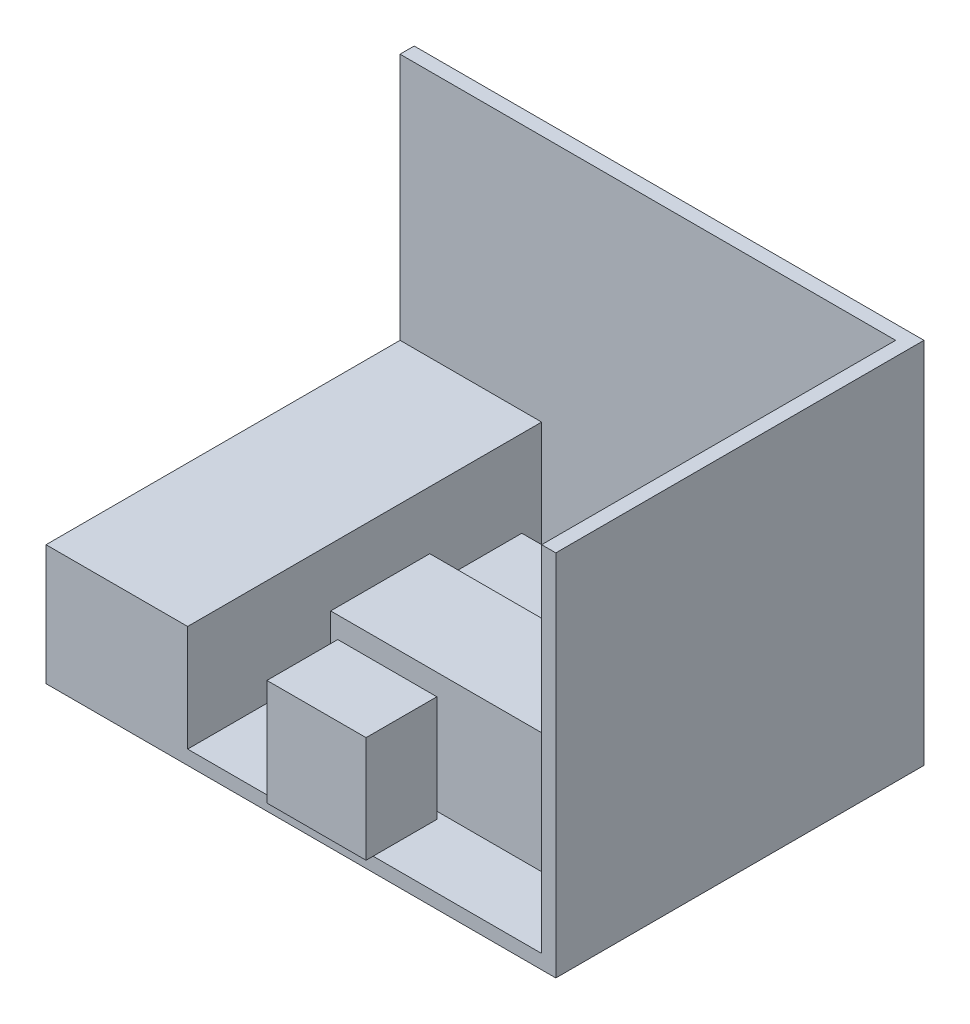
ISO-10303-21;
HEADER;
FILE_DESCRIPTION(('STEP AP214'),'2;1');
FILE_NAME('part.step','',(''),(''),'','','');
FILE_SCHEMA(('AUTOMOTIVE_DESIGN { 1 0 10303 214 1 1 1 1 }'));
ENDSEC;
DATA;
#1=APPLICATION_CONTEXT('core data for automotive mechanical design processes');
#2=APPLICATION_PROTOCOL_DEFINITION('international standard','automotive_design',2000,#1);
#3=PRODUCT_CONTEXT('',#1,'mechanical');
#4=PRODUCT('Part','Part','',(#3));
#5=PRODUCT_RELATED_PRODUCT_CATEGORY('part','',(#4));
#6=PRODUCT_DEFINITION_FORMATION('','',#4);
#7=PRODUCT_DEFINITION_CONTEXT('part definition',#1,'design');
#8=PRODUCT_DEFINITION('design','',#6,#7);
#9=PRODUCT_DEFINITION_SHAPE('','',#8);
#10=(LENGTH_UNIT() NAMED_UNIT(*) SI_UNIT(.MILLI.,.METRE.));
#11=(NAMED_UNIT(*) PLANE_ANGLE_UNIT() SI_UNIT($,.RADIAN.));
#12=(NAMED_UNIT(*) SI_UNIT($,.STERADIAN.) SOLID_ANGLE_UNIT());
#13=UNCERTAINTY_MEASURE_WITH_UNIT(LENGTH_MEASURE(1.E-05),#10,'distance_accuracy_value','');
#14=(GEOMETRIC_REPRESENTATION_CONTEXT(3) GLOBAL_UNCERTAINTY_ASSIGNED_CONTEXT((#13)) GLOBAL_UNIT_ASSIGNED_CONTEXT((#10,
#11,#12)) REPRESENTATION_CONTEXT('',''));
#15=CARTESIAN_POINT('',(0.,0.,0.));
#16=DIRECTION('',(0.,0.,1.));
#17=DIRECTION('',(1.,0.,0.));
#18=AXIS2_PLACEMENT_3D('',#15,#16,#17);
#19=CARTESIAN_POINT('',(0.,100.,0.));
#20=DIRECTION('',(0.,1.,0.));
#21=DIRECTION('',(0.,0.,1.));
#22=AXIS2_PLACEMENT_3D('',#19,#20,#21);
#23=PLANE('',#22);
#24=DIRECTION('',(1.,0.,0.));
#25=VECTOR('',#24,1.);
#26=CARTESIAN_POINT('',(1610.,100.,-1250.));
#27=LINE('',#26,#25);
#28=CARTESIAN_POINT('',(1610.,100.,-1250.));
#29=VERTEX_POINT('',#28);
#30=CARTESIAN_POINT('',(2310.,100.,-1250.));
#31=VERTEX_POINT('',#30);
#32=EDGE_CURVE('E224',#29,#31,#27,.T.);
#33=ORIENTED_EDGE('',*,*,#32,.F.);
#34=DIRECTION('',(0.,0.,1.));
#35=VECTOR('',#34,1.);
#36=CARTESIAN_POINT('',(1610.,100.,-1250.));
#37=LINE('',#36,#35);
#38=CARTESIAN_POINT('',(1610.,100.,-1750.));
#39=VERTEX_POINT('',#38);
#40=EDGE_CURVE('E219',#39,#29,#37,.T.);
#41=ORIENTED_EDGE('',*,*,#40,.F.);
#42=DIRECTION('',(-1.,0.,0.));
#43=VECTOR('',#42,1.);
#44=CARTESIAN_POINT('',(1610.,100.,-1750.));
#45=LINE('',#44,#43);
#46=CARTESIAN_POINT('',(2310.,100.,-1750.));
#47=VERTEX_POINT('',#46);
#48=EDGE_CURVE('E235',#47,#39,#45,.T.);
#49=ORIENTED_EDGE('',*,*,#48,.F.);
#50=DIRECTION('',(0.,0.,-1.));
#51=VECTOR('',#50,1.);
#52=CARTESIAN_POINT('',(2310.,100.,-1250.));
#53=LINE('',#52,#51);
#54=EDGE_CURVE('E247',#31,#47,#53,.T.);
#55=ORIENTED_EDGE('',*,*,#54,.F.);
#56=EDGE_LOOP('',(#33,#41,#49,#55));
#57=FACE_BOUND('',#56,.T.);
#58=DIRECTION('',(1.,0.,0.));
#59=VECTOR('',#58,1.);
#60=CARTESIAN_POINT('',(0.,100.,0.));
#61=LINE('',#60,#59);
#62=CARTESIAN_POINT('',(1000.,100.,0.));
#63=VERTEX_POINT('',#62);
#64=CARTESIAN_POINT('',(1610.,100.,0.));
#65=VERTEX_POINT('',#64);
#66=EDGE_CURVE('E359',#63,#65,#61,.T.);
#67=ORIENTED_EDGE('',*,*,#66,.T.);
#68=DIRECTION('',(0.,0.,1.));
#69=VECTOR('',#68,1.);
#70=CARTESIAN_POINT('',(1610.,100.,-450.));
#71=LINE('',#70,#69);
#72=CARTESIAN_POINT('',(1610.,100.,-450.));
#73=VERTEX_POINT('',#72);
#74=EDGE_CURVE('E64',#73,#65,#71,.T.);
#75=ORIENTED_EDGE('',*,*,#74,.F.);
#76=DIRECTION('',(-1.,0.,0.));
#77=VECTOR('',#76,1.);
#78=CARTESIAN_POINT('',(1610.,100.,-450.));
#79=LINE('',#78,#77);
#80=CARTESIAN_POINT('',(2310.,100.,-450.));
#81=VERTEX_POINT('',#80);
#82=EDGE_CURVE('E59',#81,#73,#79,.T.);
#83=ORIENTED_EDGE('',*,*,#82,.F.);
#84=DIRECTION('',(0.,0.,-1.));
#85=VECTOR('',#84,1.);
#86=CARTESIAN_POINT('',(2310.,100.,-450.));
#87=LINE('',#86,#85);
#88=CARTESIAN_POINT('',(2310.,100.,0.));
#89=VERTEX_POINT('',#88);
#90=EDGE_CURVE('E434',#89,#81,#87,.T.);
#91=ORIENTED_EDGE('',*,*,#90,.F.);
#92=CARTESIAN_POINT('',(3500.,100.,0.));
#93=VERTEX_POINT('',#92);
#94=EDGE_CURVE('E364',#89,#93,#61,.T.);
#95=ORIENTED_EDGE('',*,*,#94,.T.);
#96=DIRECTION('',(0.,0.,1.));
#97=VECTOR('',#96,1.);
#98=CARTESIAN_POINT('',(3500.,100.,-2.22044604925031E-13));
#99=LINE('',#98,#97);
#100=CARTESIAN_POINT('',(3500.,100.,-500.));
#101=VERTEX_POINT('',#100);
#102=EDGE_CURVE('E344',#101,#93,#99,.T.);
#103=ORIENTED_EDGE('',*,*,#102,.F.);
#104=DIRECTION('',(1.,0.,0.));
#105=VECTOR('',#104,1.);
#106=CARTESIAN_POINT('',(3510.,100.,-500.));
#107=LINE('',#106,#105);
#108=CARTESIAN_POINT('',(1510.,100.,-500.));
#109=VERTEX_POINT('',#108);
#110=EDGE_CURVE('E297',#109,#101,#107,.T.);
#111=ORIENTED_EDGE('',*,*,#110,.F.);
#112=DIRECTION('',(0.,0.,1.));
#113=VECTOR('',#112,1.);
#114=CARTESIAN_POINT('',(1510.,100.,-500.));
#115=LINE('',#114,#113);
#116=CARTESIAN_POINT('',(1510.,100.,-1200.));
#117=VERTEX_POINT('',#116);
#118=EDGE_CURVE('E306',#117,#109,#115,.T.);
#119=ORIENTED_EDGE('',*,*,#118,.F.);
#120=DIRECTION('',(-1.,0.,0.));
#121=VECTOR('',#120,1.);
#122=CARTESIAN_POINT('',(3510.,100.,-1200.));
#123=LINE('',#122,#121);
#124=CARTESIAN_POINT('',(3500.,100.,-1200.));
#125=VERTEX_POINT('',#124);
#126=EDGE_CURVE('E292',#125,#117,#123,.T.);
#127=ORIENTED_EDGE('',*,*,#126,.F.);
#128=CARTESIAN_POINT('',(3500.,100.,-2500.));
#129=VERTEX_POINT('',#128);
#130=EDGE_CURVE('E324',#129,#125,#99,.T.);
#131=ORIENTED_EDGE('',*,*,#130,.F.);
#132=DIRECTION('',(1.,0.,0.));
#133=VECTOR('',#132,1.);
#134=CARTESIAN_POINT('',(3500.,100.,-2500.));
#135=LINE('',#134,#133);
#136=CARTESIAN_POINT('',(1000.,100.,-2500.));
#137=VERTEX_POINT('',#136);
#138=EDGE_CURVE('E318',#137,#129,#135,.T.);
#139=ORIENTED_EDGE('',*,*,#138,.F.);
#140=DIRECTION('',(0.,0.,-1.));
#141=VECTOR('',#140,1.);
#142=CARTESIAN_POINT('',(1000.,100.,0.));
#143=LINE('',#142,#141);
#144=EDGE_CURVE('E266',#63,#137,#143,.T.);
#145=ORIENTED_EDGE('',*,*,#144,.F.);
#146=EDGE_LOOP('',(#67,#75,#83,#91,#95,#103,#111,#119,#127,#131,#139,#145));
#147=FACE_BOUND('',#146,.T.);
#148=ADVANCED_FACE('F43',(#57,#147),#23,.T.);
#149=CARTESIAN_POINT('',(3500.,2600.,-2500.));
#150=DIRECTION('',(0.,0.,-1.));
#151=DIRECTION('',(-1.,0.,0.));
#152=AXIS2_PLACEMENT_3D('',#149,#150,#151);
#153=PLANE('',#152);
#154=DIRECTION('',(0.,-1.,0.));
#155=VECTOR('',#154,1.);
#156=CARTESIAN_POINT('',(1000.,850.,-2500.));
#157=LINE('',#156,#155);
#158=CARTESIAN_POINT('',(1000.,850.,-2500.));
#159=VERTEX_POINT('',#158);
#160=EDGE_CURVE('E282',#159,#137,#157,.T.);
#161=ORIENTED_EDGE('',*,*,#160,.T.);
#162=ORIENTED_EDGE('',*,*,#138,.T.);
#163=DIRECTION('',(0.,-1.,0.));
#164=VECTOR('',#163,1.);
#165=CARTESIAN_POINT('',(3500.,2600.,-2500.));
#166=LINE('',#165,#164);
#167=CARTESIAN_POINT('',(3500.,2600.,-2500.));
#168=VERTEX_POINT('',#167);
#169=EDGE_CURVE('E351',#168,#129,#166,.T.);
#170=ORIENTED_EDGE('',*,*,#169,.F.);
#171=DIRECTION('',(1.,0.,0.));
#172=VECTOR('',#171,1.);
#173=CARTESIAN_POINT('',(3500.,2600.,-2500.));
#174=LINE('',#173,#172);
#175=CARTESIAN_POINT('',(0.,2600.,-2500.));
#176=VERTEX_POINT('',#175);
#177=EDGE_CURVE('E331',#176,#168,#174,.T.);
#178=ORIENTED_EDGE('',*,*,#177,.F.);
#179=DIRECTION('',(0.,-1.,0.));
#180=VECTOR('',#179,1.);
#181=CARTESIAN_POINT('',(0.,2600.,-2500.));
#182=LINE('',#181,#180);
#183=CARTESIAN_POINT('',(0.,850.,-2500.));
#184=VERTEX_POINT('',#183);
#185=EDGE_CURVE('E355',#176,#184,#182,.T.);
#186=ORIENTED_EDGE('',*,*,#185,.T.);
#187=DIRECTION('',(-1.,0.,0.));
#188=VECTOR('',#187,1.);
#189=CARTESIAN_POINT('',(0.,850.,-2500.));
#190=LINE('',#189,#188);
#191=EDGE_CURVE('E278',#159,#184,#190,.T.);
#192=ORIENTED_EDGE('',*,*,#191,.F.);
#193=EDGE_LOOP('',(#161,#162,#170,#178,#186,#192));
#194=FACE_BOUND('',#193,.T.);
#195=ADVANCED_FACE('F467',(#194),#153,.F.);
#196=CARTESIAN_POINT('',(3500.,2600.,-2.22044604925031E-13));
#197=DIRECTION('',(1.,0.,0.));
#198=DIRECTION('',(0.,0.,-1.));
#199=AXIS2_PLACEMENT_3D('',#196,#197,#198);
#200=PLANE('',#199);
#201=DIRECTION('',(0.,-1.,0.));
#202=VECTOR('',#201,1.);
#203=CARTESIAN_POINT('',(3500.,2600.,-1200.));
#204=LINE('',#203,#202);
#205=CARTESIAN_POINT('',(3500.,950.,-1200.));
#206=VERTEX_POINT('',#205);
#207=EDGE_CURVE('E11',#206,#125,#204,.T.);
#208=ORIENTED_EDGE('',*,*,#207,.F.);
#209=DIRECTION('',(0.,0.,1.));
#210=VECTOR('',#209,1.);
#211=CARTESIAN_POINT('',(3500.,950.,-2.22044604925031E-13));
#212=LINE('',#211,#210);
#213=CARTESIAN_POINT('',(3500.,950.,-500.));
#214=VERTEX_POINT('',#213);
#215=EDGE_CURVE('E392',#206,#214,#212,.T.);
#216=ORIENTED_EDGE('',*,*,#215,.T.);
#217=DIRECTION('',(0.,1.,0.));
#218=VECTOR('',#217,1.);
#219=CARTESIAN_POINT('',(3500.,2600.,-500.));
#220=LINE('',#219,#218);
#221=EDGE_CURVE('E52',#101,#214,#220,.T.);
#222=ORIENTED_EDGE('',*,*,#221,.F.);
#223=ORIENTED_EDGE('',*,*,#102,.T.);
#224=DIRECTION('',(0.,-1.,0.));
#225=VECTOR('',#224,1.);
#226=CARTESIAN_POINT('',(3500.,2600.,-2.22044604925031E-13));
#227=LINE('',#226,#225);
#228=CARTESIAN_POINT('',(3500.,2600.,-2.22044604925031E-13));
#229=VERTEX_POINT('',#228);
#230=EDGE_CURVE('E341',#229,#93,#227,.T.);
#231=ORIENTED_EDGE('',*,*,#230,.F.);
#232=DIRECTION('',(0.,0.,1.));
#233=VECTOR('',#232,1.);
#234=CARTESIAN_POINT('',(3500.,2600.,-2.22044604925031E-13));
#235=LINE('',#234,#233);
#236=EDGE_CURVE('E334',#168,#229,#235,.T.);
#237=ORIENTED_EDGE('',*,*,#236,.F.);
#238=ORIENTED_EDGE('',*,*,#169,.T.);
#239=ORIENTED_EDGE('',*,*,#130,.T.);
#240=EDGE_LOOP('',(#208,#216,#222,#223,#231,#237,#238,#239));
#241=FACE_BOUND('',#240,.T.);
#242=ADVANCED_FACE('F406',(#241),#200,.F.);
#243=CARTESIAN_POINT('',(0.,100.,-2600.));
#244=DIRECTION('',(1.,0.,0.));
#245=DIRECTION('',(0.,0.,-1.));
#246=AXIS2_PLACEMENT_3D('',#243,#244,#245);
#247=PLANE('',#246);
#248=DIRECTION('',(0.,-1.,0.));
#249=VECTOR('',#248,1.);
#250=CARTESIAN_POINT('',(0.,100.,0.));
#251=LINE('',#250,#249);
#252=CARTESIAN_POINT('',(0.,850.,0.));
#253=VERTEX_POINT('',#252);
#254=CARTESIAN_POINT('',(0.,0.,0.));
#255=VERTEX_POINT('',#254);
#256=EDGE_CURVE('E388',#253,#255,#251,.T.);
#257=ORIENTED_EDGE('',*,*,#256,.F.);
#258=DIRECTION('',(0.,0.,1.));
#259=VECTOR('',#258,1.);
#260=CARTESIAN_POINT('',(0.,850.,0.));
#261=LINE('',#260,#259);
#262=EDGE_CURVE('E267',#184,#253,#261,.T.);
#263=ORIENTED_EDGE('',*,*,#262,.F.);
#264=ORIENTED_EDGE('',*,*,#185,.F.);
#265=DIRECTION('',(0.,0.,1.));
#266=VECTOR('',#265,1.);
#267=CARTESIAN_POINT('',(0.,2600.,-2500.));
#268=LINE('',#267,#266);
#269=CARTESIAN_POINT('',(0.,2600.,-2600.));
#270=VERTEX_POINT('',#269);
#271=EDGE_CURVE('E328',#270,#176,#268,.T.);
#272=ORIENTED_EDGE('',*,*,#271,.F.);
#273=DIRECTION('',(0.,-1.,0.));
#274=VECTOR('',#273,1.);
#275=CARTESIAN_POINT('',(0.,100.,-2600.));
#276=LINE('',#275,#274);
#277=CARTESIAN_POINT('',(0.,0.,-2600.));
#278=VERTEX_POINT('',#277);
#279=EDGE_CURVE('E362',#270,#278,#276,.T.);
#280=ORIENTED_EDGE('',*,*,#279,.T.);
#281=DIRECTION('',(0.,0.,1.));
#282=VECTOR('',#281,1.);
#283=CARTESIAN_POINT('',(0.,0.,-2600.));
#284=LINE('',#283,#282);
#285=EDGE_CURVE('E358',#278,#255,#284,.T.);
#286=ORIENTED_EDGE('',*,*,#285,.T.);
#287=EDGE_LOOP('',(#257,#263,#264,#272,#280,#286));
#288=FACE_BOUND('',#287,.T.);
#289=ADVANCED_FACE('F45',(#288),#247,.F.);
#290=CARTESIAN_POINT('',(0.,100.,0.));
#291=DIRECTION('',(0.,0.,-1.));
#292=DIRECTION('',(-1.,0.,0.));
#293=AXIS2_PLACEMENT_3D('',#290,#291,#292);
#294=PLANE('',#293);
#295=DIRECTION('',(1.,0.,0.));
#296=VECTOR('',#295,1.);
#297=CARTESIAN_POINT('',(0.,0.,0.));
#298=LINE('',#297,#296);
#299=CARTESIAN_POINT('',(3600.,0.,0.));
#300=VERTEX_POINT('',#299);
#301=EDGE_CURVE('E368',#255,#300,#298,.T.);
#302=ORIENTED_EDGE('',*,*,#301,.T.);
#303=DIRECTION('',(0.,-1.,0.));
#304=VECTOR('',#303,1.);
#305=CARTESIAN_POINT('',(3600.,100.,0.));
#306=LINE('',#305,#304);
#307=CARTESIAN_POINT('',(3600.,2600.,0.));
#308=VERTEX_POINT('',#307);
#309=EDGE_CURVE('E384',#308,#300,#306,.T.);
#310=ORIENTED_EDGE('',*,*,#309,.F.);
#311=DIRECTION('',(1.,0.,0.));
#312=VECTOR('',#311,1.);
#313=CARTESIAN_POINT('',(3600.,2600.,0.));
#314=LINE('',#313,#312);
#315=EDGE_CURVE('E337',#229,#308,#314,.T.);
#316=ORIENTED_EDGE('',*,*,#315,.F.);
#317=ORIENTED_EDGE('',*,*,#230,.T.);
#318=ORIENTED_EDGE('',*,*,#94,.F.);
#319=EDGE_CURVE('E363',#65,#89,#61,.T.);
#320=ORIENTED_EDGE('',*,*,#319,.F.);
#321=ORIENTED_EDGE('',*,*,#66,.F.);
#322=DIRECTION('',(0.,-1.,0.));
#323=VECTOR('',#322,1.);
#324=CARTESIAN_POINT('',(1000.,850.,0.));
#325=LINE('',#324,#323);
#326=CARTESIAN_POINT('',(1000.,850.,0.));
#327=VERTEX_POINT('',#326);
#328=EDGE_CURVE('E288',#327,#63,#325,.T.);
#329=ORIENTED_EDGE('',*,*,#328,.F.);
#330=DIRECTION('',(1.,0.,0.));
#331=VECTOR('',#330,1.);
#332=CARTESIAN_POINT('',(0.,850.,0.));
#333=LINE('',#332,#331);
#334=EDGE_CURVE('E271',#253,#327,#333,.T.);
#335=ORIENTED_EDGE('',*,*,#334,.F.);
#336=ORIENTED_EDGE('',*,*,#256,.T.);
#337=EDGE_LOOP('',(#302,#310,#316,#317,#318,#320,#321,#329,#335,#336));
#338=FACE_BOUND('',#337,.T.);
#339=ADVANCED_FACE('F491',(#338),#294,.F.);
#340=CARTESIAN_POINT('',(3600.,100.,-2600.));
#341=DIRECTION('',(-1.,0.,0.));
#342=DIRECTION('',(0.,0.,1.));
#343=AXIS2_PLACEMENT_3D('',#340,#341,#342);
#344=PLANE('',#343);
#345=DIRECTION('',(0.,0.,-1.));
#346=VECTOR('',#345,1.);
#347=CARTESIAN_POINT('',(3600.,0.,-2600.));
#348=LINE('',#347,#346);
#349=CARTESIAN_POINT('',(3600.,0.,-2600.));
#350=VERTEX_POINT('',#349);
#351=EDGE_CURVE('E371',#300,#350,#348,.T.);
#352=ORIENTED_EDGE('',*,*,#351,.T.);
#353=DIRECTION('',(0.,-1.,0.));
#354=VECTOR('',#353,1.);
#355=CARTESIAN_POINT('',(3600.,100.,-2600.));
#356=LINE('',#355,#354);
#357=CARTESIAN_POINT('',(3600.,2600.,-2600.));
#358=VERTEX_POINT('',#357);
#359=EDGE_CURVE('E380',#358,#350,#356,.T.);
#360=ORIENTED_EDGE('',*,*,#359,.F.);
#361=DIRECTION('',(0.,0.,-1.));
#362=VECTOR('',#361,1.);
#363=CARTESIAN_POINT('',(3600.,2600.,-2600.));
#364=LINE('',#363,#362);
#365=EDGE_CURVE('E319',#308,#358,#364,.T.);
#366=ORIENTED_EDGE('',*,*,#365,.F.);
#367=ORIENTED_EDGE('',*,*,#309,.T.);
#368=EDGE_LOOP('',(#352,#360,#366,#367));
#369=FACE_BOUND('',#368,.T.);
#370=ADVANCED_FACE('F488',(#369),#344,.F.);
#371=CARTESIAN_POINT('',(0.,100.,-2600.));
#372=DIRECTION('',(0.,0.,1.));
#373=DIRECTION('',(1.,0.,0.));
#374=AXIS2_PLACEMENT_3D('',#371,#372,#373);
#375=PLANE('',#374);
#376=DIRECTION('',(-1.,0.,0.));
#377=VECTOR('',#376,1.);
#378=CARTESIAN_POINT('',(0.,0.,-2600.));
#379=LINE('',#378,#377);
#380=EDGE_CURVE('E374',#350,#278,#379,.T.);
#381=ORIENTED_EDGE('',*,*,#380,.T.);
#382=ORIENTED_EDGE('',*,*,#279,.F.);
#383=DIRECTION('',(-1.,0.,0.));
#384=VECTOR('',#383,1.);
#385=CARTESIAN_POINT('',(0.,2600.,-2600.));
#386=LINE('',#385,#384);
#387=EDGE_CURVE('E323',#358,#270,#386,.T.);
#388=ORIENTED_EDGE('',*,*,#387,.F.);
#389=ORIENTED_EDGE('',*,*,#359,.T.);
#390=EDGE_LOOP('',(#381,#382,#388,#389));
#391=FACE_BOUND('',#390,.T.);
#392=ADVANCED_FACE('F484',(#391),#375,.F.);
#393=CARTESIAN_POINT('',(0.,0.,0.));
#394=DIRECTION('',(0.,1.,0.));
#395=DIRECTION('',(0.,0.,1.));
#396=AXIS2_PLACEMENT_3D('',#393,#394,#395);
#397=PLANE('',#396);
#398=ORIENTED_EDGE('',*,*,#285,.F.);
#399=ORIENTED_EDGE('',*,*,#380,.F.);
#400=ORIENTED_EDGE('',*,*,#351,.F.);
#401=ORIENTED_EDGE('',*,*,#301,.F.);
#402=EDGE_LOOP('',(#398,#399,#400,#401));
#403=FACE_BOUND('',#402,.T.);
#404=ADVANCED_FACE('F480',(#403),#397,.F.);
#405=CARTESIAN_POINT('',(0.,2600.,0.));
#406=DIRECTION('',(0.,-1.,0.));
#407=DIRECTION('',(0.,0.,-1.));
#408=AXIS2_PLACEMENT_3D('',#405,#406,#407);
#409=PLANE('',#408);
#410=ORIENTED_EDGE('',*,*,#365,.T.);
#411=ORIENTED_EDGE('',*,*,#387,.T.);
#412=ORIENTED_EDGE('',*,*,#271,.T.);
#413=ORIENTED_EDGE('',*,*,#177,.T.);
#414=ORIENTED_EDGE('',*,*,#236,.T.);
#415=ORIENTED_EDGE('',*,*,#315,.T.);
#416=EDGE_LOOP('',(#410,#411,#412,#413,#414,#415));
#417=FACE_BOUND('',#416,.T.);
#418=ADVANCED_FACE('F483',(#417),#409,.F.);
#419=CARTESIAN_POINT('',(3510.,950.,-1200.));
#420=DIRECTION('',(0.,0.,1.));
#421=DIRECTION('',(1.,0.,0.));
#422=AXIS2_PLACEMENT_3D('',#419,#420,#421);
#423=PLANE('',#422);
#424=DIRECTION('',(-1.,0.,0.));
#425=VECTOR('',#424,1.);
#426=CARTESIAN_POINT('',(3510.,950.,-1200.));
#427=LINE('',#426,#425);
#428=CARTESIAN_POINT('',(1510.,950.,-1200.));
#429=VERTEX_POINT('',#428);
#430=EDGE_CURVE('E293',#206,#429,#427,.T.);
#431=ORIENTED_EDGE('',*,*,#430,.F.);
#432=ORIENTED_EDGE('',*,*,#207,.T.);
#433=ORIENTED_EDGE('',*,*,#126,.T.);
#434=DIRECTION('',(0.,-1.,0.));
#435=VECTOR('',#434,1.);
#436=CARTESIAN_POINT('',(1510.,950.,-1200.));
#437=LINE('',#436,#435);
#438=EDGE_CURVE('E314',#429,#117,#437,.T.);
#439=ORIENTED_EDGE('',*,*,#438,.F.);
#440=EDGE_LOOP('',(#431,#432,#433,#439));
#441=FACE_BOUND('',#440,.T.);
#442=ADVANCED_FACE('F412',(#441),#423,.F.);
#443=CARTESIAN_POINT('',(3510.,950.,-500.));
#444=DIRECTION('',(0.,0.,-1.));
#445=DIRECTION('',(-1.,0.,0.));
#446=AXIS2_PLACEMENT_3D('',#443,#444,#445);
#447=PLANE('',#446);
#448=ORIENTED_EDGE('',*,*,#110,.T.);
#449=ORIENTED_EDGE('',*,*,#221,.T.);
#450=DIRECTION('',(1.,0.,0.));
#451=VECTOR('',#450,1.);
#452=CARTESIAN_POINT('',(3510.,950.,-500.));
#453=LINE('',#452,#451);
#454=CARTESIAN_POINT('',(1510.,950.,-500.));
#455=VERTEX_POINT('',#454);
#456=EDGE_CURVE('E300',#455,#214,#453,.T.);
#457=ORIENTED_EDGE('',*,*,#456,.F.);
#458=DIRECTION('',(0.,-1.,0.));
#459=VECTOR('',#458,1.);
#460=CARTESIAN_POINT('',(1510.,950.,-500.));
#461=LINE('',#460,#459);
#462=EDGE_CURVE('E303',#455,#109,#461,.T.);
#463=ORIENTED_EDGE('',*,*,#462,.T.);
#464=EDGE_LOOP('',(#448,#449,#457,#463));
#465=FACE_BOUND('',#464,.T.);
#466=ADVANCED_FACE('F400',(#465),#447,.F.);
#467=CARTESIAN_POINT('',(0.,950.,0.));
#468=DIRECTION('',(0.,1.,0.));
#469=DIRECTION('',(0.,0.,1.));
#470=AXIS2_PLACEMENT_3D('',#467,#468,#469);
#471=PLANE('',#470);
#472=ORIENTED_EDGE('',*,*,#215,.F.);
#473=ORIENTED_EDGE('',*,*,#430,.T.);
#474=DIRECTION('',(0.,0.,1.));
#475=VECTOR('',#474,1.);
#476=CARTESIAN_POINT('',(1510.,950.,-500.));
#477=LINE('',#476,#475);
#478=EDGE_CURVE('E296',#429,#455,#477,.T.);
#479=ORIENTED_EDGE('',*,*,#478,.T.);
#480=ORIENTED_EDGE('',*,*,#456,.T.);
#481=EDGE_LOOP('',(#472,#473,#479,#480));
#482=FACE_BOUND('',#481,.T.);
#483=ADVANCED_FACE('F409',(#482),#471,.T.);
#484=CARTESIAN_POINT('',(1510.,950.,-500.));
#485=DIRECTION('',(1.,0.,0.));
#486=DIRECTION('',(0.,0.,-1.));
#487=AXIS2_PLACEMENT_3D('',#484,#485,#486);
#488=PLANE('',#487);
#489=ORIENTED_EDGE('',*,*,#118,.T.);
#490=ORIENTED_EDGE('',*,*,#462,.F.);
#491=ORIENTED_EDGE('',*,*,#478,.F.);
#492=ORIENTED_EDGE('',*,*,#438,.T.);
#493=EDGE_LOOP('',(#489,#490,#491,#492));
#494=FACE_BOUND('',#493,.T.);
#495=ADVANCED_FACE('F418',(#494),#488,.F.);
#496=CARTESIAN_POINT('',(1000.,850.,0.));
#497=DIRECTION('',(-1.,0.,0.));
#498=DIRECTION('',(0.,0.,1.));
#499=AXIS2_PLACEMENT_3D('',#496,#497,#498);
#500=PLANE('',#499);
#501=ORIENTED_EDGE('',*,*,#144,.T.);
#502=ORIENTED_EDGE('',*,*,#160,.F.);
#503=DIRECTION('',(0.,0.,-1.));
#504=VECTOR('',#503,1.);
#505=CARTESIAN_POINT('',(1000.,850.,0.));
#506=LINE('',#505,#504);
#507=EDGE_CURVE('E274',#327,#159,#506,.T.);
#508=ORIENTED_EDGE('',*,*,#507,.F.);
#509=ORIENTED_EDGE('',*,*,#328,.T.);
#510=EDGE_LOOP('',(#501,#502,#508,#509));
#511=FACE_BOUND('',#510,.T.);
#512=ADVANCED_FACE('F516',(#511),#500,.F.);
#513=CARTESIAN_POINT('',(0.,850.,0.));
#514=DIRECTION('',(0.,-1.,0.));
#515=DIRECTION('',(0.,0.,-1.));
#516=AXIS2_PLACEMENT_3D('',#513,#514,#515);
#517=PLANE('',#516);
#518=ORIENTED_EDGE('',*,*,#262,.T.);
#519=ORIENTED_EDGE('',*,*,#334,.T.);
#520=ORIENTED_EDGE('',*,*,#507,.T.);
#521=ORIENTED_EDGE('',*,*,#191,.T.);
#522=EDGE_LOOP('',(#518,#519,#520,#521));
#523=FACE_BOUND('',#522,.T.);
#524=ADVANCED_FACE('F520',(#523),#517,.F.);
#525=CARTESIAN_POINT('',(1610.,850.,-1250.));
#526=DIRECTION('',(1.,0.,0.));
#527=DIRECTION('',(0.,0.,-1.));
#528=AXIS2_PLACEMENT_3D('',#525,#526,#527);
#529=PLANE('',#528);
#530=ORIENTED_EDGE('',*,*,#40,.T.);
#531=DIRECTION('',(0.,-1.,0.));
#532=VECTOR('',#531,1.);
#533=CARTESIAN_POINT('',(1610.,850.,-1250.));
#534=LINE('',#533,#532);
#535=CARTESIAN_POINT('',(1610.,850.,-1250.));
#536=VERTEX_POINT('',#535);
#537=EDGE_CURVE('E263',#536,#29,#534,.T.);
#538=ORIENTED_EDGE('',*,*,#537,.F.);
#539=DIRECTION('',(0.,0.,1.));
#540=VECTOR('',#539,1.);
#541=CARTESIAN_POINT('',(1610.,850.,-1250.));
#542=LINE('',#541,#540);
#543=CARTESIAN_POINT('',(1610.,850.,-1750.));
#544=VERTEX_POINT('',#543);
#545=EDGE_CURVE('E230',#544,#536,#542,.T.);
#546=ORIENTED_EDGE('',*,*,#545,.F.);
#547=DIRECTION('',(0.,-1.,0.));
#548=VECTOR('',#547,1.);
#549=CARTESIAN_POINT('',(1610.,850.,-1750.));
#550=LINE('',#549,#548);
#551=EDGE_CURVE('E243',#544,#39,#550,.T.);
#552=ORIENTED_EDGE('',*,*,#551,.T.);
#553=EDGE_LOOP('',(#530,#538,#546,#552));
#554=FACE_BOUND('',#553,.T.);
#555=ADVANCED_FACE('F522',(#554),#529,.F.);
#556=CARTESIAN_POINT('',(1610.,850.,-1250.));
#557=DIRECTION('',(0.,0.,-1.));
#558=DIRECTION('',(-1.,0.,0.));
#559=AXIS2_PLACEMENT_3D('',#556,#557,#558);
#560=PLANE('',#559);
#561=ORIENTED_EDGE('',*,*,#32,.T.);
#562=DIRECTION('',(0.,-1.,0.));
#563=VECTOR('',#562,1.);
#564=CARTESIAN_POINT('',(2310.,850.,-1250.));
#565=LINE('',#564,#563);
#566=CARTESIAN_POINT('',(2310.,850.,-1250.));
#567=VERTEX_POINT('',#566);
#568=EDGE_CURVE('E259',#567,#31,#565,.T.);
#569=ORIENTED_EDGE('',*,*,#568,.F.);
#570=DIRECTION('',(1.,0.,0.));
#571=VECTOR('',#570,1.);
#572=CARTESIAN_POINT('',(1610.,850.,-1250.));
#573=LINE('',#572,#571);
#574=EDGE_CURVE('E234',#536,#567,#573,.T.);
#575=ORIENTED_EDGE('',*,*,#574,.F.);
#576=ORIENTED_EDGE('',*,*,#537,.T.);
#577=EDGE_LOOP('',(#561,#569,#575,#576));
#578=FACE_BOUND('',#577,.T.);
#579=ADVANCED_FACE('F528',(#578),#560,.F.);
#580=CARTESIAN_POINT('',(2310.,850.,-1250.));
#581=DIRECTION('',(-1.,0.,0.));
#582=DIRECTION('',(0.,0.,1.));
#583=AXIS2_PLACEMENT_3D('',#580,#581,#582);
#584=PLANE('',#583);
#585=ORIENTED_EDGE('',*,*,#54,.T.);
#586=DIRECTION('',(0.,-1.,0.));
#587=VECTOR('',#586,1.);
#588=CARTESIAN_POINT('',(2310.,850.,-1750.));
#589=LINE('',#588,#587);
#590=CARTESIAN_POINT('',(2310.,850.,-1750.));
#591=VERTEX_POINT('',#590);
#592=EDGE_CURVE('E256',#591,#47,#589,.T.);
#593=ORIENTED_EDGE('',*,*,#592,.F.);
#594=DIRECTION('',(0.,0.,-1.));
#595=VECTOR('',#594,1.);
#596=CARTESIAN_POINT('',(2310.,850.,-1250.));
#597=LINE('',#596,#595);
#598=EDGE_CURVE('E238',#567,#591,#597,.T.);
#599=ORIENTED_EDGE('',*,*,#598,.F.);
#600=ORIENTED_EDGE('',*,*,#568,.T.);
#601=EDGE_LOOP('',(#585,#593,#599,#600));
#602=FACE_BOUND('',#601,.T.);
#603=ADVANCED_FACE('F615',(#602),#584,.F.);
#604=CARTESIAN_POINT('',(1610.,850.,-1750.));
#605=DIRECTION('',(0.,0.,1.));
#606=DIRECTION('',(1.,0.,0.));
#607=AXIS2_PLACEMENT_3D('',#604,#605,#606);
#608=PLANE('',#607);
#609=ORIENTED_EDGE('',*,*,#48,.T.);
#610=ORIENTED_EDGE('',*,*,#551,.F.);
#611=DIRECTION('',(-1.,0.,0.));
#612=VECTOR('',#611,1.);
#613=CARTESIAN_POINT('',(1610.,850.,-1750.));
#614=LINE('',#613,#612);
#615=EDGE_CURVE('E241',#591,#544,#614,.T.);
#616=ORIENTED_EDGE('',*,*,#615,.F.);
#617=ORIENTED_EDGE('',*,*,#592,.T.);
#618=EDGE_LOOP('',(#609,#610,#616,#617));
#619=FACE_BOUND('',#618,.T.);
#620=ADVANCED_FACE('F625',(#619),#608,.F.);
#621=CARTESIAN_POINT('',(0.,850.,0.));
#622=DIRECTION('',(0.,-1.,0.));
#623=DIRECTION('',(0.,0.,-1.));
#624=AXIS2_PLACEMENT_3D('',#621,#622,#623);
#625=PLANE('',#624);
#626=ORIENTED_EDGE('',*,*,#545,.T.);
#627=ORIENTED_EDGE('',*,*,#574,.T.);
#628=ORIENTED_EDGE('',*,*,#598,.T.);
#629=ORIENTED_EDGE('',*,*,#615,.T.);
#630=EDGE_LOOP('',(#626,#627,#628,#629));
#631=FACE_BOUND('',#630,.T.);
#632=ADVANCED_FACE('F635',(#631),#625,.F.);
#633=CARTESIAN_POINT('',(0.,100.,0.));
#634=DIRECTION('',(0.,1.,0.));
#635=DIRECTION('',(0.,0.,1.));
#636=AXIS2_PLACEMENT_3D('',#633,#634,#635);
#637=PLANE('',#636);
#638=CARTESIAN_POINT('',(1610.,100.,50.0000000000003));
#639=VERTEX_POINT('',#638);
#640=EDGE_CURVE('E216',#65,#639,#71,.T.);
#641=ORIENTED_EDGE('',*,*,#640,.F.);
#642=ORIENTED_EDGE('',*,*,#319,.T.);
#643=CARTESIAN_POINT('',(2310.,100.,50.0000000000003));
#644=VERTEX_POINT('',#643);
#645=EDGE_CURVE('E428',#644,#89,#87,.T.);
#646=ORIENTED_EDGE('',*,*,#645,.F.);
#647=DIRECTION('',(1.,0.,0.));
#648=VECTOR('',#647,1.);
#649=CARTESIAN_POINT('',(1610.,100.,50.0000000000003));
#650=LINE('',#649,#648);
#651=EDGE_CURVE('E441',#639,#644,#650,.T.);
#652=ORIENTED_EDGE('',*,*,#651,.F.);
#653=EDGE_LOOP('',(#641,#642,#646,#652));
#654=FACE_BOUND('',#653,.T.);
#655=ADVANCED_FACE('F427',(#654),#637,.F.);
#656=CARTESIAN_POINT('',(1610.,850.,-450.));
#657=DIRECTION('',(1.,0.,0.));
#658=DIRECTION('',(0.,0.,-1.));
#659=AXIS2_PLACEMENT_3D('',#656,#657,#658);
#660=PLANE('',#659);
#661=ORIENTED_EDGE('',*,*,#74,.T.);
#662=ORIENTED_EDGE('',*,*,#640,.T.);
#663=DIRECTION('',(0.,-1.,0.));
#664=VECTOR('',#663,1.);
#665=CARTESIAN_POINT('',(1610.,850.,50.0000000000003));
#666=LINE('',#665,#664);
#667=CARTESIAN_POINT('',(1610.,850.,50.0000000000003));
#668=VERTEX_POINT('',#667);
#669=EDGE_CURVE('E196',#668,#639,#666,.T.);
#670=ORIENTED_EDGE('',*,*,#669,.F.);
#671=DIRECTION('',(0.,0.,1.));
#672=VECTOR('',#671,1.);
#673=CARTESIAN_POINT('',(1610.,850.,-450.));
#674=LINE('',#673,#672);
#675=CARTESIAN_POINT('',(1610.,850.,-450.));
#676=VERTEX_POINT('',#675);
#677=EDGE_CURVE('E203',#676,#668,#674,.T.);
#678=ORIENTED_EDGE('',*,*,#677,.F.);
#679=DIRECTION('',(0.,-1.,0.));
#680=VECTOR('',#679,1.);
#681=CARTESIAN_POINT('',(1610.,850.,-450.));
#682=LINE('',#681,#680);
#683=EDGE_CURVE('E445',#676,#73,#682,.T.);
#684=ORIENTED_EDGE('',*,*,#683,.T.);
#685=EDGE_LOOP('',(#661,#662,#670,#678,#684));
#686=FACE_BOUND('',#685,.T.);
#687=ADVANCED_FACE('F214',(#686),#660,.F.);
#688=CARTESIAN_POINT('',(1610.,850.,50.0000000000003));
#689=DIRECTION('',(0.,0.,-1.));
#690=DIRECTION('',(-1.,0.,0.));
#691=AXIS2_PLACEMENT_3D('',#688,#689,#690);
#692=PLANE('',#691);
#693=ORIENTED_EDGE('',*,*,#651,.T.);
#694=DIRECTION('',(0.,-1.,0.));
#695=VECTOR('',#694,1.);
#696=CARTESIAN_POINT('',(2310.,850.,50.0000000000003));
#697=LINE('',#696,#695);
#698=CARTESIAN_POINT('',(2310.,850.,50.0000000000003));
#699=VERTEX_POINT('',#698);
#700=EDGE_CURVE('E198',#699,#644,#697,.T.);
#701=ORIENTED_EDGE('',*,*,#700,.F.);
#702=DIRECTION('',(1.,0.,0.));
#703=VECTOR('',#702,1.);
#704=CARTESIAN_POINT('',(1610.,850.,50.0000000000003));
#705=LINE('',#704,#703);
#706=EDGE_CURVE('E192',#668,#699,#705,.T.);
#707=ORIENTED_EDGE('',*,*,#706,.F.);
#708=ORIENTED_EDGE('',*,*,#669,.T.);
#709=EDGE_LOOP('',(#693,#701,#707,#708));
#710=FACE_BOUND('',#709,.T.);
#711=ADVANCED_FACE('F194',(#710),#692,.F.);
#712=CARTESIAN_POINT('',(2310.,850.,-450.));
#713=DIRECTION('',(-1.,0.,0.));
#714=DIRECTION('',(0.,0.,1.));
#715=AXIS2_PLACEMENT_3D('',#712,#713,#714);
#716=PLANE('',#715);
#717=ORIENTED_EDGE('',*,*,#645,.T.);
#718=ORIENTED_EDGE('',*,*,#90,.T.);
#719=DIRECTION('',(0.,-1.,0.));
#720=VECTOR('',#719,1.);
#721=CARTESIAN_POINT('',(2310.,850.,-450.));
#722=LINE('',#721,#720);
#723=CARTESIAN_POINT('',(2310.,850.,-450.));
#724=VERTEX_POINT('',#723);
#725=EDGE_CURVE('E226',#724,#81,#722,.T.);
#726=ORIENTED_EDGE('',*,*,#725,.F.);
#727=DIRECTION('',(0.,0.,-1.));
#728=VECTOR('',#727,1.);
#729=CARTESIAN_POINT('',(2310.,850.,-450.));
#730=LINE('',#729,#728);
#731=EDGE_CURVE('E202',#699,#724,#730,.T.);
#732=ORIENTED_EDGE('',*,*,#731,.F.);
#733=ORIENTED_EDGE('',*,*,#700,.T.);
#734=EDGE_LOOP('',(#717,#718,#726,#732,#733));
#735=FACE_BOUND('',#734,.T.);
#736=ADVANCED_FACE('F432',(#735),#716,.F.);
#737=CARTESIAN_POINT('',(1610.,850.,-450.));
#738=DIRECTION('',(0.,0.,1.));
#739=DIRECTION('',(1.,0.,0.));
#740=AXIS2_PLACEMENT_3D('',#737,#738,#739);
#741=PLANE('',#740);
#742=ORIENTED_EDGE('',*,*,#82,.T.);
#743=ORIENTED_EDGE('',*,*,#683,.F.);
#744=DIRECTION('',(-1.,0.,0.));
#745=VECTOR('',#744,1.);
#746=CARTESIAN_POINT('',(1610.,850.,-450.));
#747=LINE('',#746,#745);
#748=EDGE_CURVE('E208',#724,#676,#747,.T.);
#749=ORIENTED_EDGE('',*,*,#748,.F.);
#750=ORIENTED_EDGE('',*,*,#725,.T.);
#751=EDGE_LOOP('',(#742,#743,#749,#750));
#752=FACE_BOUND('',#751,.T.);
#753=ADVANCED_FACE('F449',(#752),#741,.F.);
#754=CARTESIAN_POINT('',(0.,850.,0.));
#755=DIRECTION('',(0.,1.,0.));
#756=DIRECTION('',(0.,0.,1.));
#757=AXIS2_PLACEMENT_3D('',#754,#755,#756);
#758=PLANE('',#757);
#759=ORIENTED_EDGE('',*,*,#677,.T.);
#760=ORIENTED_EDGE('',*,*,#706,.T.);
#761=ORIENTED_EDGE('',*,*,#731,.T.);
#762=ORIENTED_EDGE('',*,*,#748,.T.);
#763=EDGE_LOOP('',(#759,#760,#761,#762));
#764=FACE_BOUND('',#763,.T.);
#765=ADVANCED_FACE('F206',(#764),#758,.T.);
#766=CLOSED_SHELL('',(#148,#195,#242,#289,#339,#370,#392,#404,#418,#442,#466,#483,#495,#512,
#524,#555,#579,#603,#620,#632,#655,#687,#711,#736,#753,#765));
#767=MANIFOLD_SOLID_BREP('B2',#766);
#768=ADVANCED_BREP_SHAPE_REPRESENTATION('',(#18,#767),#14);
#769=SHAPE_DEFINITION_REPRESENTATION(#9,#768);
ENDSEC;
END-ISO-10303-21;
